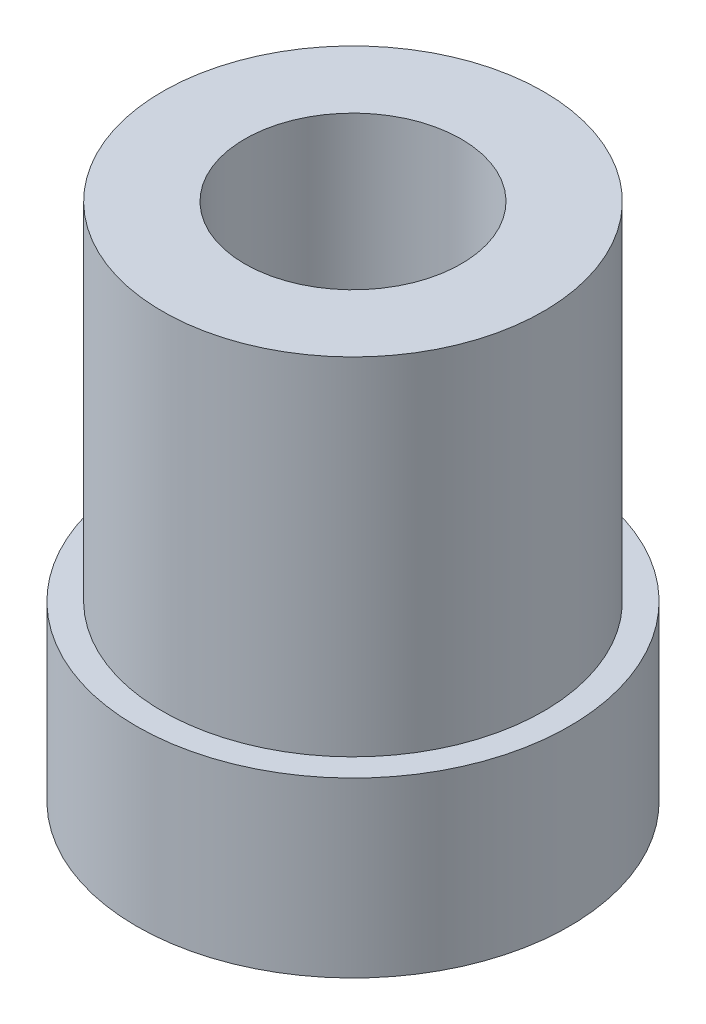
ISO-10303-21;
HEADER;
FILE_DESCRIPTION(('STEP AP214'),'2;1');
FILE_NAME('part.step','',(''),(''),'','','');
FILE_SCHEMA(('AUTOMOTIVE_DESIGN { 1 0 10303 214 1 1 1 1 }'));
ENDSEC;
DATA;
#1=APPLICATION_CONTEXT('core data for automotive mechanical design processes');
#2=APPLICATION_PROTOCOL_DEFINITION('international standard','automotive_design',2000,#1);
#3=PRODUCT_CONTEXT('',#1,'mechanical');
#4=PRODUCT('Part','Part','',(#3));
#5=PRODUCT_RELATED_PRODUCT_CATEGORY('part','',(#4));
#6=PRODUCT_DEFINITION_FORMATION('','',#4);
#7=PRODUCT_DEFINITION_CONTEXT('part definition',#1,'design');
#8=PRODUCT_DEFINITION('design','',#6,#7);
#9=PRODUCT_DEFINITION_SHAPE('','',#8);
#10=(LENGTH_UNIT() NAMED_UNIT(*) SI_UNIT(.MILLI.,.METRE.));
#11=(NAMED_UNIT(*) PLANE_ANGLE_UNIT() SI_UNIT($,.RADIAN.));
#12=(NAMED_UNIT(*) SI_UNIT($,.STERADIAN.) SOLID_ANGLE_UNIT());
#13=UNCERTAINTY_MEASURE_WITH_UNIT(LENGTH_MEASURE(1.E-05),#10,'distance_accuracy_value','');
#14=(GEOMETRIC_REPRESENTATION_CONTEXT(3) GLOBAL_UNCERTAINTY_ASSIGNED_CONTEXT((#13)) GLOBAL_UNIT_ASSIGNED_CONTEXT((#10,
#11,#12)) REPRESENTATION_CONTEXT('',''));
#15=CARTESIAN_POINT('',(0.,0.,0.));
#16=DIRECTION('',(0.,0.,1.));
#17=DIRECTION('',(1.,0.,0.));
#18=AXIS2_PLACEMENT_3D('',#15,#16,#17);
#19=CARTESIAN_POINT('',(0.,19.05,0.));
#20=DIRECTION('',(0.,-1.,0.));
#21=DIRECTION('',(0.,0.,-1.));
#22=AXIS2_PLACEMENT_3D('',#19,#20,#21);
#23=CYLINDRICAL_SURFACE('',#22,3.96875);
#24=CARTESIAN_POINT('',(0.,19.05,0.));
#25=DIRECTION('',(0.,1.,0.));
#26=DIRECTION('',(0.,0.,1.));
#27=AXIS2_PLACEMENT_3D('',#24,#25,#26);
#28=CIRCLE('',#27,3.96875);
#29=CARTESIAN_POINT('',(0.,19.05,-3.96875));
#30=VERTEX_POINT('',#29);
#31=EDGE_CURVE('E52',#30,#30,#28,.T.);
#32=CARTESIAN_POINT('',(0.,0.,0.));
#33=DIRECTION('',(0.,1.,0.));
#34=DIRECTION('',(0.,0.,1.));
#35=AXIS2_PLACEMENT_3D('',#32,#33,#34);
#36=CIRCLE('',#35,3.96875);
#37=CARTESIAN_POINT('',(0.,0.,-3.96875));
#38=VERTEX_POINT('',#37);
#39=EDGE_CURVE('E48',#38,#38,#36,.T.);
#40=CARTESIAN_POINT('',(0.,19.05,-3.96875));
#41=CARTESIAN_POINT('',(0.,18.8515625,-3.96875));
#42=CARTESIAN_POINT('',(0.,18.653125,-3.96875));
#43=CARTESIAN_POINT('',(0.,18.25625,-3.96875));
#44=CARTESIAN_POINT('',(0.,18.0578125,-3.96875));
#45=CARTESIAN_POINT('',(0.,17.6609375,-3.96875));
#46=CARTESIAN_POINT('',(0.,17.4625,-3.96875));
#47=CARTESIAN_POINT('',(0.,17.065625,-3.96875));
#48=CARTESIAN_POINT('',(0.,16.8671875,-3.96875));
#49=CARTESIAN_POINT('',(0.,16.4703125,-3.96875));
#50=CARTESIAN_POINT('',(0.,16.271875,-3.96875));
#51=CARTESIAN_POINT('',(0.,15.875,-3.96875));
#52=CARTESIAN_POINT('',(0.,15.6765625,-3.96875));
#53=CARTESIAN_POINT('',(0.,15.2796875,-3.96875));
#54=CARTESIAN_POINT('',(0.,15.08125,-3.96875));
#55=CARTESIAN_POINT('',(0.,14.684375,-3.96875));
#56=CARTESIAN_POINT('',(0.,14.4859375,-3.96875));
#57=CARTESIAN_POINT('',(0.,14.0890625,-3.96875));
#58=CARTESIAN_POINT('',(0.,13.890625,-3.96875));
#59=CARTESIAN_POINT('',(0.,13.49375,-3.96875));
#60=CARTESIAN_POINT('',(0.,13.2953125,-3.96875));
#61=CARTESIAN_POINT('',(0.,12.8984375,-3.96875));
#62=CARTESIAN_POINT('',(0.,12.7,-3.96875));
#63=CARTESIAN_POINT('',(0.,12.303125,-3.96875));
#64=CARTESIAN_POINT('',(0.,12.1046875,-3.96875));
#65=CARTESIAN_POINT('',(0.,11.7078125,-3.96875));
#66=CARTESIAN_POINT('',(0.,11.509375,-3.96875));
#67=CARTESIAN_POINT('',(0.,11.1125,-3.96875));
#68=CARTESIAN_POINT('',(0.,10.9140625,-3.96875));
#69=CARTESIAN_POINT('',(0.,10.5171875,-3.96875));
#70=CARTESIAN_POINT('',(0.,10.31875,-3.96875));
#71=CARTESIAN_POINT('',(0.,9.921875,-3.96875));
#72=CARTESIAN_POINT('',(0.,9.7234375,-3.96875));
#73=CARTESIAN_POINT('',(0.,9.3265625,-3.96875));
#74=CARTESIAN_POINT('',(0.,9.128125,-3.96875));
#75=CARTESIAN_POINT('',(0.,8.73125,-3.96875));
#76=CARTESIAN_POINT('',(0.,8.5328125,-3.96875));
#77=CARTESIAN_POINT('',(0.,8.1359375,-3.96875));
#78=CARTESIAN_POINT('',(0.,7.9375,-3.96875));
#79=CARTESIAN_POINT('',(0.,7.540625,-3.96875));
#80=CARTESIAN_POINT('',(0.,7.3421875,-3.96875));
#81=CARTESIAN_POINT('',(0.,6.9453125,-3.96875));
#82=CARTESIAN_POINT('',(0.,6.746875,-3.96875));
#83=CARTESIAN_POINT('',(0.,6.35,-3.96875));
#84=CARTESIAN_POINT('',(0.,6.1515625,-3.96875));
#85=CARTESIAN_POINT('',(0.,5.7546875,-3.96875));
#86=CARTESIAN_POINT('',(0.,5.55625,-3.96875));
#87=CARTESIAN_POINT('',(0.,5.159375,-3.96875));
#88=CARTESIAN_POINT('',(0.,4.9609375,-3.96875));
#89=CARTESIAN_POINT('',(0.,4.5640625,-3.96875));
#90=CARTESIAN_POINT('',(0.,4.365625,-3.96875));
#91=CARTESIAN_POINT('',(0.,3.96875,-3.96875));
#92=CARTESIAN_POINT('',(0.,3.7703125,-3.96875));
#93=CARTESIAN_POINT('',(0.,3.3734375,-3.96875));
#94=CARTESIAN_POINT('',(0.,3.175,-3.96875));
#95=CARTESIAN_POINT('',(0.,2.778125,-3.96875));
#96=CARTESIAN_POINT('',(0.,2.5796875,-3.96875));
#97=CARTESIAN_POINT('',(0.,2.1828125,-3.96875));
#98=CARTESIAN_POINT('',(0.,1.984375,-3.96875));
#99=CARTESIAN_POINT('',(0.,1.5875,-3.96875));
#100=CARTESIAN_POINT('',(0.,1.3890625,-3.96875));
#101=CARTESIAN_POINT('',(0.,0.992187500000001,-3.96875));
#102=CARTESIAN_POINT('',(0.,0.793750000000001,-3.96875));
#103=CARTESIAN_POINT('',(0.,0.396875,-3.96875));
#104=CARTESIAN_POINT('',(0.,0.1984375,-3.96875));
#105=CARTESIAN_POINT('',(0.,0.,-3.96875));
#106=B_SPLINE_CURVE_WITH_KNOTS('',3,(#40,#41,#42,#43,#44,#45,#46,#47,#48,#49,#50,#51,#52,#53,
#54,#55,#56,#57,#58,#59,#60,#61,#62,#63,#64,#65,#66,#67,#68,#69,#70,#71,#72,#73,#74,#75,#76,#77,
#78,#79,#80,#81,#82,#83,#84,#85,#86,#87,#88,#89,#90,#91,#92,#93,#94,#95,#96,#97,#98,#99,#100,
#101,#102,#103,#104,#105),.UNSPECIFIED.,.F.,.F.,(4,2,2,2,2,2,2,2,2,2,2,2,2,2,2,2,2,2,2,2,2,2,2,
2,2,2,2,2,2,2,2,2,4),(0.,0.5953125,1.190625,1.7859375,2.38125,2.9765625,3.571875,4.1671875,
4.7625,5.3578125,5.953125,6.5484375,7.14375,7.7390625,8.334375,8.9296875,9.525,10.1203125,
10.715625,11.3109375,11.90625,12.5015625,13.096875,13.6921875,14.2875,14.8828125,15.478125,
16.0734375,16.66875,17.2640625,17.859375,18.4546875,19.05),.UNSPECIFIED.);
#107=EDGE_CURVE('BSEAM45',#30,#38,#106,.T.);
#108=ORIENTED_EDGE('',*,*,#31,.T.);
#109=ORIENTED_EDGE('',*,*,#39,.F.);
#110=ORIENTED_EDGE('',*,*,#107,.T.);
#111=ORIENTED_EDGE('',*,*,#107,.F.);
#112=EDGE_LOOP('',(#108,#110,#109,#111));
#113=FACE_BOUND('',#112,.T.);
#114=ADVANCED_FACE('F45',(#113),#23,.F.);
#115=CARTESIAN_POINT('',(0.,19.05,0.));
#116=DIRECTION('',(0.,-1.,0.));
#117=DIRECTION('',(0.,0.,-1.));
#118=AXIS2_PLACEMENT_3D('',#115,#116,#117);
#119=CYLINDRICAL_SURFACE('',#118,6.985);
#120=CARTESIAN_POINT('',(0.,6.35,0.));
#121=DIRECTION('',(0.,1.,0.));
#122=DIRECTION('',(0.,0.,1.));
#123=AXIS2_PLACEMENT_3D('',#120,#121,#122);
#124=CIRCLE('',#123,6.985);
#125=CARTESIAN_POINT('',(0.,6.35,-6.985));
#126=VERTEX_POINT('',#125);
#127=EDGE_CURVE('E61',#126,#126,#124,.T.);
#128=CARTESIAN_POINT('',(0.,19.05,0.));
#129=DIRECTION('',(0.,1.,0.));
#130=DIRECTION('',(0.,0.,1.));
#131=AXIS2_PLACEMENT_3D('',#128,#129,#130);
#132=CIRCLE('',#131,6.985);
#133=CARTESIAN_POINT('',(0.,19.05,-6.985));
#134=VERTEX_POINT('',#133);
#135=EDGE_CURVE('E10',#134,#134,#132,.T.);
#136=CARTESIAN_POINT('',(0.,6.35,-6.985));
#137=CARTESIAN_POINT('',(0.,6.48229166666667,-6.985));
#138=CARTESIAN_POINT('',(0.,6.61458333333333,-6.985));
#139=CARTESIAN_POINT('',(0.,6.87916666666667,-6.985));
#140=CARTESIAN_POINT('',(0.,7.01145833333333,-6.985));
#141=CARTESIAN_POINT('',(0.,7.27604166666667,-6.985));
#142=CARTESIAN_POINT('',(0.,7.40833333333333,-6.985));
#143=CARTESIAN_POINT('',(0.,7.67291666666667,-6.985));
#144=CARTESIAN_POINT('',(0.,7.80520833333333,-6.985));
#145=CARTESIAN_POINT('',(0.,8.06979166666667,-6.985));
#146=CARTESIAN_POINT('',(0.,8.20208333333333,-6.985));
#147=CARTESIAN_POINT('',(0.,8.46666666666667,-6.985));
#148=CARTESIAN_POINT('',(0.,8.59895833333333,-6.985));
#149=CARTESIAN_POINT('',(0.,8.86354166666666,-6.985));
#150=CARTESIAN_POINT('',(0.,8.99583333333333,-6.985));
#151=CARTESIAN_POINT('',(0.,9.26041666666667,-6.985));
#152=CARTESIAN_POINT('',(0.,9.39270833333333,-6.985));
#153=CARTESIAN_POINT('',(0.,9.65729166666667,-6.985));
#154=CARTESIAN_POINT('',(0.,9.78958333333333,-6.985));
#155=CARTESIAN_POINT('',(0.,10.0541666666667,-6.985));
#156=CARTESIAN_POINT('',(0.,10.1864583333333,-6.985));
#157=CARTESIAN_POINT('',(0.,10.4510416666667,-6.985));
#158=CARTESIAN_POINT('',(0.,10.5833333333333,-6.985));
#159=CARTESIAN_POINT('',(0.,10.8479166666667,-6.985));
#160=CARTESIAN_POINT('',(0.,10.9802083333333,-6.985));
#161=CARTESIAN_POINT('',(0.,11.2447916666667,-6.985));
#162=CARTESIAN_POINT('',(0.,11.3770833333333,-6.985));
#163=CARTESIAN_POINT('',(0.,11.6416666666667,-6.985));
#164=CARTESIAN_POINT('',(0.,11.7739583333333,-6.985));
#165=CARTESIAN_POINT('',(0.,12.0385416666667,-6.985));
#166=CARTESIAN_POINT('',(0.,12.1708333333333,-6.985));
#167=CARTESIAN_POINT('',(0.,12.4354166666667,-6.985));
#168=CARTESIAN_POINT('',(0.,12.5677083333333,-6.985));
#169=CARTESIAN_POINT('',(0.,12.8322916666667,-6.985));
#170=CARTESIAN_POINT('',(0.,12.9645833333333,-6.985));
#171=CARTESIAN_POINT('',(0.,13.2291666666667,-6.985));
#172=CARTESIAN_POINT('',(0.,13.3614583333333,-6.985));
#173=CARTESIAN_POINT('',(0.,13.6260416666667,-6.985));
#174=CARTESIAN_POINT('',(0.,13.7583333333333,-6.985));
#175=CARTESIAN_POINT('',(0.,14.0229166666667,-6.985));
#176=CARTESIAN_POINT('',(0.,14.1552083333333,-6.985));
#177=CARTESIAN_POINT('',(0.,14.4197916666667,-6.985));
#178=CARTESIAN_POINT('',(0.,14.5520833333333,-6.985));
#179=CARTESIAN_POINT('',(0.,14.8166666666667,-6.985));
#180=CARTESIAN_POINT('',(0.,14.9489583333333,-6.985));
#181=CARTESIAN_POINT('',(0.,15.2135416666667,-6.985));
#182=CARTESIAN_POINT('',(0.,15.3458333333333,-6.985));
#183=CARTESIAN_POINT('',(0.,15.6104166666667,-6.985));
#184=CARTESIAN_POINT('',(0.,15.7427083333333,-6.985));
#185=CARTESIAN_POINT('',(0.,16.0072916666667,-6.985));
#186=CARTESIAN_POINT('',(0.,16.1395833333333,-6.985));
#187=CARTESIAN_POINT('',(0.,16.4041666666667,-6.985));
#188=CARTESIAN_POINT('',(0.,16.5364583333333,-6.985));
#189=CARTESIAN_POINT('',(0.,16.8010416666667,-6.985));
#190=CARTESIAN_POINT('',(0.,16.9333333333333,-6.985));
#191=CARTESIAN_POINT('',(0.,17.1979166666667,-6.985));
#192=CARTESIAN_POINT('',(0.,17.3302083333333,-6.985));
#193=CARTESIAN_POINT('',(0.,17.5947916666667,-6.985));
#194=CARTESIAN_POINT('',(0.,17.7270833333333,-6.985));
#195=CARTESIAN_POINT('',(0.,17.9916666666667,-6.985));
#196=CARTESIAN_POINT('',(0.,18.1239583333333,-6.985));
#197=CARTESIAN_POINT('',(0.,18.3885416666667,-6.985));
#198=CARTESIAN_POINT('',(0.,18.5208333333333,-6.985));
#199=CARTESIAN_POINT('',(0.,18.7854166666667,-6.985));
#200=CARTESIAN_POINT('',(0.,18.9177083333333,-6.985));
#201=CARTESIAN_POINT('',(0.,19.05,-6.985));
#202=B_SPLINE_CURVE_WITH_KNOTS('',3,(#136,#137,#138,#139,#140,#141,#142,#143,#144,#145,#146,
#147,#148,#149,#150,#151,#152,#153,#154,#155,#156,#157,#158,#159,#160,#161,#162,#163,#164,#165,
#166,#167,#168,#169,#170,#171,#172,#173,#174,#175,#176,#177,#178,#179,#180,#181,#182,#183,#184,
#185,#186,#187,#188,#189,#190,#191,#192,#193,#194,#195,#196,#197,#198,#199,#200,#201),
.UNSPECIFIED.,.F.,.F.,(4,2,2,2,2,2,2,2,2,2,2,2,2,2,2,2,2,2,2,2,2,2,2,2,2,2,2,2,2,2,2,2,4),(0.,
0.396875,0.793749999999999,1.190625,1.5875,1.984375,2.38125,2.778125,3.175,3.571875,3.96875,
4.365625,4.7625,5.159375,5.55625,5.953125,6.35,6.746875,7.14375,7.540625,7.9375,8.334375,
8.73125,9.128125,9.525,9.921875,10.31875,10.715625,11.1125,11.509375,11.90625,12.303125,12.7),.UNSPECIFIED.);
#203=EDGE_CURVE('BSEAM68',#126,#134,#202,.T.);
#204=ORIENTED_EDGE('',*,*,#127,.T.);
#205=ORIENTED_EDGE('',*,*,#135,.F.);
#206=ORIENTED_EDGE('',*,*,#203,.T.);
#207=ORIENTED_EDGE('',*,*,#203,.F.);
#208=EDGE_LOOP('',(#204,#206,#205,#207));
#209=FACE_BOUND('',#208,.T.);
#210=ADVANCED_FACE('F68',(#209),#119,.T.);
#211=CARTESIAN_POINT('',(0.,19.05,0.));
#212=DIRECTION('',(0.,1.,0.));
#213=DIRECTION('',(0.,0.,1.));
#214=AXIS2_PLACEMENT_3D('',#211,#212,#213);
#215=PLANE('',#214);
#216=ORIENTED_EDGE('',*,*,#31,.F.);
#217=EDGE_LOOP('',(#216));
#218=FACE_BOUND('',#217,.T.);
#219=ORIENTED_EDGE('',*,*,#135,.T.);
#220=EDGE_LOOP('',(#219));
#221=FACE_BOUND('',#220,.T.);
#222=ADVANCED_FACE('F85',(#218,#221),#215,.T.);
#223=CARTESIAN_POINT('',(0.,0.,0.));
#224=DIRECTION('',(0.,1.,0.));
#225=DIRECTION('',(0.,0.,1.));
#226=AXIS2_PLACEMENT_3D('',#223,#224,#225);
#227=PLANE('',#226);
#228=ORIENTED_EDGE('',*,*,#39,.T.);
#229=EDGE_LOOP('',(#228));
#230=FACE_BOUND('',#229,.T.);
#231=CARTESIAN_POINT('',(0.,0.,0.));
#232=DIRECTION('',(0.,1.,0.));
#233=DIRECTION('',(0.,0.,1.));
#234=AXIS2_PLACEMENT_3D('',#231,#232,#233);
#235=CIRCLE('',#234,7.9375);
#236=CARTESIAN_POINT('',(0.,0.,7.9375));
#237=VERTEX_POINT('',#236);
#238=EDGE_CURVE('E58',#237,#237,#235,.T.);
#239=ORIENTED_EDGE('',*,*,#238,.F.);
#240=EDGE_LOOP('',(#239));
#241=FACE_BOUND('',#240,.T.);
#242=ADVANCED_FACE('F80',(#230,#241),#227,.F.);
#243=CARTESIAN_POINT('',(0.,6.35,0.));
#244=DIRECTION('',(0.,-1.,0.));
#245=DIRECTION('',(0.,0.,-1.));
#246=AXIS2_PLACEMENT_3D('',#243,#244,#245);
#247=CYLINDRICAL_SURFACE('',#246,7.9375);
#248=CARTESIAN_POINT('',(0.,6.35,0.));
#249=DIRECTION('',(0.,1.,0.));
#250=DIRECTION('',(0.,0.,1.));
#251=AXIS2_PLACEMENT_3D('',#248,#249,#250);
#252=CIRCLE('',#251,7.9375);
#253=CARTESIAN_POINT('',(0.,6.35,7.9375));
#254=VERTEX_POINT('',#253);
#255=EDGE_CURVE('E62',#254,#254,#252,.T.);
#256=ORIENTED_EDGE('',*,*,#255,.F.);
#257=EDGE_LOOP('',(#256));
#258=FACE_BOUND('',#257,.T.);
#259=ORIENTED_EDGE('',*,*,#238,.T.);
#260=EDGE_LOOP('',(#259));
#261=FACE_BOUND('',#260,.T.);
#262=ADVANCED_FACE('F74',(#258,#261),#247,.T.);
#263=CARTESIAN_POINT('',(0.,6.35,0.));
#264=DIRECTION('',(0.,1.,0.));
#265=DIRECTION('',(0.,0.,1.));
#266=AXIS2_PLACEMENT_3D('',#263,#264,#265);
#267=PLANE('',#266);
#268=ORIENTED_EDGE('',*,*,#127,.F.);
#269=EDGE_LOOP('',(#268));
#270=FACE_BOUND('',#269,.T.);
#271=ORIENTED_EDGE('',*,*,#255,.T.);
#272=EDGE_LOOP('',(#271));
#273=FACE_BOUND('',#272,.T.);
#274=ADVANCED_FACE('F71',(#270,#273),#267,.T.);
#275=CLOSED_SHELL('',(#114,#210,#222,#242,#262,#274));
#276=MANIFOLD_SOLID_BREP('B2',#275);
#277=ADVANCED_BREP_SHAPE_REPRESENTATION('',(#18,#276),#14);
#278=SHAPE_DEFINITION_REPRESENTATION(#9,#277);
ENDSEC;
END-ISO-10303-21;
